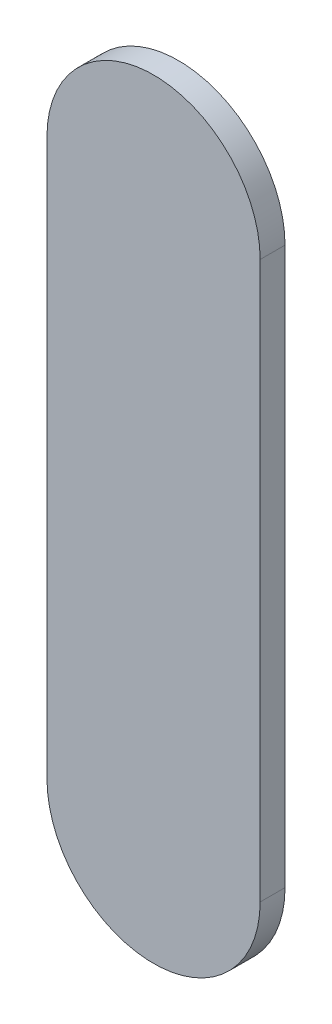
ISO-10303-21;
HEADER;
FILE_DESCRIPTION(('STEP AP214'),'2;1');
FILE_NAME('part.step','',(''),(''),'','','');
FILE_SCHEMA(('AUTOMOTIVE_DESIGN { 1 0 10303 214 1 1 1 1 }'));
ENDSEC;
DATA;
#1=APPLICATION_CONTEXT('core data for automotive mechanical design processes');
#2=APPLICATION_PROTOCOL_DEFINITION('international standard','automotive_design',2000,#1);
#3=PRODUCT_CONTEXT('',#1,'mechanical');
#4=PRODUCT('Part','Part','',(#3));
#5=PRODUCT_RELATED_PRODUCT_CATEGORY('part','',(#4));
#6=PRODUCT_DEFINITION_FORMATION('','',#4);
#7=PRODUCT_DEFINITION_CONTEXT('part definition',#1,'design');
#8=PRODUCT_DEFINITION('design','',#6,#7);
#9=PRODUCT_DEFINITION_SHAPE('','',#8);
#10=(LENGTH_UNIT() NAMED_UNIT(*) SI_UNIT(.MILLI.,.METRE.));
#11=(NAMED_UNIT(*) PLANE_ANGLE_UNIT() SI_UNIT($,.RADIAN.));
#12=(NAMED_UNIT(*) SI_UNIT($,.STERADIAN.) SOLID_ANGLE_UNIT());
#13=UNCERTAINTY_MEASURE_WITH_UNIT(LENGTH_MEASURE(1.E-05),#10,'distance_accuracy_value','');
#14=(GEOMETRIC_REPRESENTATION_CONTEXT(3) GLOBAL_UNCERTAINTY_ASSIGNED_CONTEXT((#13)) GLOBAL_UNIT_ASSIGNED_CONTEXT((#10,
#11,#12)) REPRESENTATION_CONTEXT('',''));
#15=CARTESIAN_POINT('',(0.,0.,0.));
#16=DIRECTION('',(0.,0.,1.));
#17=DIRECTION('',(1.,0.,0.));
#18=AXIS2_PLACEMENT_3D('',#15,#16,#17);
#19=CARTESIAN_POINT('',(149.45,-114.513,1.635));
#20=DIRECTION('',(0.,0.,1.));
#21=DIRECTION('',(1.,0.,0.));
#22=AXIS2_PLACEMENT_3D('',#19,#20,#21);
#23=PLANE('',#22);
#24=DIRECTION('',(0.,1.,0.));
#25=VECTOR('',#24,1.);
#26=CARTESIAN_POINT('',(149.45,-114.513,1.635));
#27=LINE('',#26,#25);
#28=CARTESIAN_POINT('',(149.45,-114.513,1.635));
#29=VERTEX_POINT('',#28);
#30=CARTESIAN_POINT('',(149.45,-113.73,1.635));
#31=VERTEX_POINT('',#30);
#32=EDGE_CURVE('E79',#29,#31,#27,.T.);
#33=ORIENTED_EDGE('',*,*,#32,.T.);
#34=CARTESIAN_POINT('',(149.3,-113.73,1.635));
#35=DIRECTION('',(0.,0.,1.));
#36=DIRECTION('',(1.,0.,0.));
#37=AXIS2_PLACEMENT_3D('',#34,#35,#36);
#38=CIRCLE('',#37,0.15);
#39=CARTESIAN_POINT('',(149.15,-113.73,1.635));
#40=VERTEX_POINT('',#39);
#41=EDGE_CURVE('E77',#31,#40,#38,.T.);
#42=ORIENTED_EDGE('',*,*,#41,.T.);
#43=DIRECTION('',(0.,-1.,0.));
#44=VECTOR('',#43,1.);
#45=CARTESIAN_POINT('',(149.15,-113.73,1.635));
#46=LINE('',#45,#44);
#47=CARTESIAN_POINT('',(149.15,-114.513,1.635));
#48=VERTEX_POINT('',#47);
#49=EDGE_CURVE('E66',#40,#48,#46,.T.);
#50=ORIENTED_EDGE('',*,*,#49,.T.);
#51=CARTESIAN_POINT('',(149.3,-114.513,1.635));
#52=DIRECTION('',(0.,0.,1.));
#53=DIRECTION('',(-1.,0.,0.));
#54=AXIS2_PLACEMENT_3D('',#51,#52,#53);
#55=CIRCLE('',#54,0.15);
#56=EDGE_CURVE('E11',#48,#29,#55,.T.);
#57=ORIENTED_EDGE('',*,*,#56,.T.);
#58=EDGE_LOOP('',(#33,#42,#50,#57));
#59=FACE_BOUND('',#58,.T.);
#60=ADVANCED_FACE('F17',(#59),#23,.T.);
#61=CARTESIAN_POINT('',(149.45,-114.513,1.6));
#62=DIRECTION('',(0.,0.,1.));
#63=DIRECTION('',(1.,0.,0.));
#64=AXIS2_PLACEMENT_3D('',#61,#62,#63);
#65=PLANE('',#64);
#66=CARTESIAN_POINT('',(149.3,-114.513,1.6));
#67=DIRECTION('',(0.,0.,1.));
#68=DIRECTION('',(-1.,0.,0.));
#69=AXIS2_PLACEMENT_3D('',#66,#67,#68);
#70=CIRCLE('',#69,0.15);
#71=CARTESIAN_POINT('',(149.15,-114.513,1.6));
#72=VERTEX_POINT('',#71);
#73=CARTESIAN_POINT('',(149.45,-114.513,1.6));
#74=VERTEX_POINT('',#73);
#75=EDGE_CURVE('E28',#72,#74,#70,.T.);
#76=ORIENTED_EDGE('',*,*,#75,.F.);
#77=DIRECTION('',(0.,-1.,0.));
#78=VECTOR('',#77,1.);
#79=CARTESIAN_POINT('',(149.15,-113.73,1.6));
#80=LINE('',#79,#78);
#81=CARTESIAN_POINT('',(149.15,-113.73,1.6));
#82=VERTEX_POINT('',#81);
#83=EDGE_CURVE('E84',#82,#72,#80,.T.);
#84=ORIENTED_EDGE('',*,*,#83,.F.);
#85=CARTESIAN_POINT('',(149.3,-113.73,1.6));
#86=DIRECTION('',(0.,0.,1.));
#87=DIRECTION('',(1.,0.,0.));
#88=AXIS2_PLACEMENT_3D('',#85,#86,#87);
#89=CIRCLE('',#88,0.15);
#90=CARTESIAN_POINT('',(149.45,-113.73,1.6));
#91=VERTEX_POINT('',#90);
#92=EDGE_CURVE('E86',#91,#82,#89,.T.);
#93=ORIENTED_EDGE('',*,*,#92,.F.);
#94=DIRECTION('',(0.,1.,0.));
#95=VECTOR('',#94,1.);
#96=CARTESIAN_POINT('',(149.45,-114.513,1.6));
#97=LINE('',#96,#95);
#98=EDGE_CURVE('E195',#74,#91,#97,.T.);
#99=ORIENTED_EDGE('',*,*,#98,.F.);
#100=EDGE_LOOP('',(#76,#84,#93,#99));
#101=FACE_BOUND('',#100,.T.);
#102=ADVANCED_FACE('F19',(#101),#65,.F.);
#103=CARTESIAN_POINT('',(149.3,-114.513,1.6));
#104=DIRECTION('',(0.,0.,-1.));
#105=DIRECTION('',(-1.,0.,0.));
#106=AXIS2_PLACEMENT_3D('',#103,#104,#105);
#107=CYLINDRICAL_SURFACE('',#106,0.15);
#108=ORIENTED_EDGE('',*,*,#75,.T.);
#109=DIRECTION('',(0.,0.,1.));
#110=VECTOR('',#109,1.);
#111=CARTESIAN_POINT('',(149.45,-114.513,1.6));
#112=LINE('',#111,#110);
#113=EDGE_CURVE('E93',#74,#29,#112,.T.);
#114=ORIENTED_EDGE('',*,*,#113,.T.);
#115=ORIENTED_EDGE('',*,*,#56,.F.);
#116=DIRECTION('',(0.,0.,1.));
#117=VECTOR('',#116,1.);
#118=CARTESIAN_POINT('',(149.15,-114.513,1.6));
#119=LINE('',#118,#117);
#120=EDGE_CURVE('E21',#72,#48,#119,.T.);
#121=ORIENTED_EDGE('',*,*,#120,.F.);
#122=EDGE_LOOP('',(#108,#114,#115,#121));
#123=FACE_BOUND('',#122,.T.);
#124=ADVANCED_FACE('F147',(#123),#107,.T.);
#125=CARTESIAN_POINT('',(149.15,-113.73,1.6));
#126=DIRECTION('',(1.,0.,0.));
#127=DIRECTION('',(0.,1.,0.));
#128=AXIS2_PLACEMENT_3D('',#125,#126,#127);
#129=PLANE('',#128);
#130=ORIENTED_EDGE('',*,*,#83,.T.);
#131=ORIENTED_EDGE('',*,*,#120,.T.);
#132=ORIENTED_EDGE('',*,*,#49,.F.);
#133=DIRECTION('',(0.,0.,1.));
#134=VECTOR('',#133,1.);
#135=CARTESIAN_POINT('',(149.15,-113.73,1.6));
#136=LINE('',#135,#134);
#137=EDGE_CURVE('E71',#82,#40,#136,.T.);
#138=ORIENTED_EDGE('',*,*,#137,.F.);
#139=EDGE_LOOP('',(#130,#131,#132,#138));
#140=FACE_BOUND('',#139,.T.);
#141=ADVANCED_FACE('F69',(#140),#129,.F.);
#142=CARTESIAN_POINT('',(149.3,-113.73,1.6));
#143=DIRECTION('',(0.,0.,-1.));
#144=DIRECTION('',(1.,0.,0.));
#145=AXIS2_PLACEMENT_3D('',#142,#143,#144);
#146=CYLINDRICAL_SURFACE('',#145,0.15);
#147=ORIENTED_EDGE('',*,*,#92,.T.);
#148=ORIENTED_EDGE('',*,*,#137,.T.);
#149=ORIENTED_EDGE('',*,*,#41,.F.);
#150=DIRECTION('',(0.,0.,1.));
#151=VECTOR('',#150,1.);
#152=CARTESIAN_POINT('',(149.45,-113.73,1.6));
#153=LINE('',#152,#151);
#154=EDGE_CURVE('E199',#91,#31,#153,.T.);
#155=ORIENTED_EDGE('',*,*,#154,.F.);
#156=EDGE_LOOP('',(#147,#148,#149,#155));
#157=FACE_BOUND('',#156,.T.);
#158=ADVANCED_FACE('F85',(#157),#146,.T.);
#159=CARTESIAN_POINT('',(149.45,-114.513,1.6));
#160=DIRECTION('',(-1.,0.,0.));
#161=DIRECTION('',(0.,0.,1.));
#162=AXIS2_PLACEMENT_3D('',#159,#160,#161);
#163=PLANE('',#162);
#164=ORIENTED_EDGE('',*,*,#98,.T.);
#165=ORIENTED_EDGE('',*,*,#154,.T.);
#166=ORIENTED_EDGE('',*,*,#32,.F.);
#167=ORIENTED_EDGE('',*,*,#113,.F.);
#168=EDGE_LOOP('',(#164,#165,#166,#167));
#169=FACE_BOUND('',#168,.T.);
#170=ADVANCED_FACE('F123',(#169),#163,.F.);
#171=CLOSED_SHELL('',(#60,#102,#124,#141,#158,#170));
#172=MANIFOLD_SOLID_BREP('B1',#171);
#173=ADVANCED_BREP_SHAPE_REPRESENTATION('',(#18,#172),#14);
#174=SHAPE_DEFINITION_REPRESENTATION(#9,#173);
ENDSEC;
END-ISO-10303-21;
